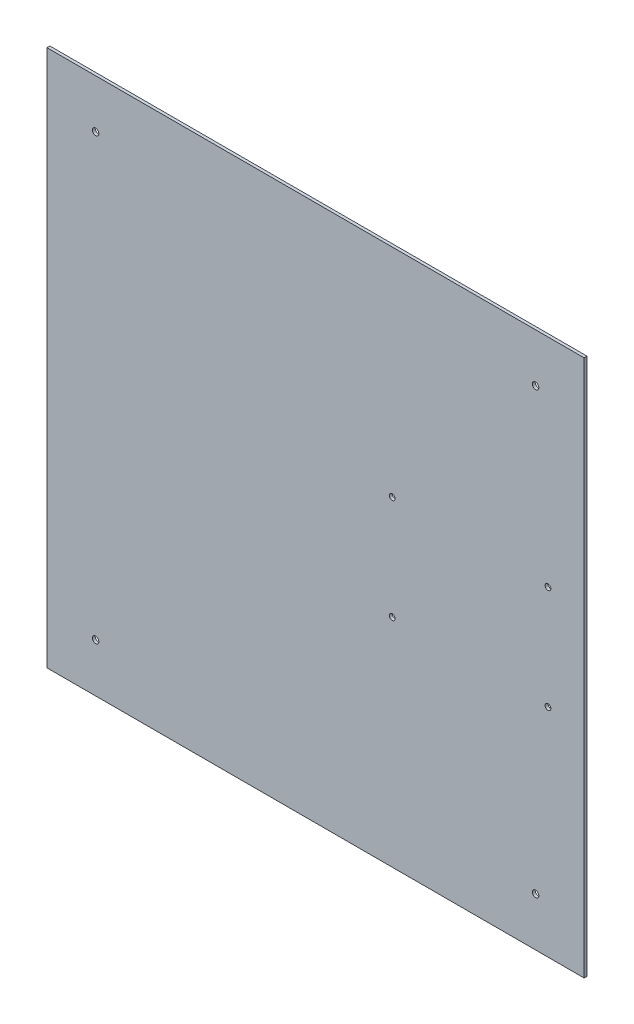
ISO-10303-21;
HEADER;
FILE_DESCRIPTION(('STEP AP214'),'2;1');
FILE_NAME('part.step','',(''),(''),'','','');
FILE_SCHEMA(('AUTOMOTIVE_DESIGN { 1 0 10303 214 1 1 1 1 }'));
ENDSEC;
DATA;
#1=APPLICATION_CONTEXT('core data for automotive mechanical design processes');
#2=APPLICATION_PROTOCOL_DEFINITION('international standard','automotive_design',2000,#1);
#3=PRODUCT_CONTEXT('',#1,'mechanical');
#4=PRODUCT('Part','Part','',(#3));
#5=PRODUCT_RELATED_PRODUCT_CATEGORY('part','',(#4));
#6=PRODUCT_DEFINITION_FORMATION('','',#4);
#7=PRODUCT_DEFINITION_CONTEXT('part definition',#1,'design');
#8=PRODUCT_DEFINITION('design','',#6,#7);
#9=PRODUCT_DEFINITION_SHAPE('','',#8);
#10=(LENGTH_UNIT() NAMED_UNIT(*) SI_UNIT(.MILLI.,.METRE.));
#11=(NAMED_UNIT(*) PLANE_ANGLE_UNIT() SI_UNIT($,.RADIAN.));
#12=(NAMED_UNIT(*) SI_UNIT($,.STERADIAN.) SOLID_ANGLE_UNIT());
#13=UNCERTAINTY_MEASURE_WITH_UNIT(LENGTH_MEASURE(1.E-05),#10,'distance_accuracy_value','');
#14=(GEOMETRIC_REPRESENTATION_CONTEXT(3) GLOBAL_UNCERTAINTY_ASSIGNED_CONTEXT((#13)) GLOBAL_UNIT_ASSIGNED_CONTEXT((#10,
#11,#12)) REPRESENTATION_CONTEXT('',''));
#15=CARTESIAN_POINT('',(0.,0.,0.));
#16=DIRECTION('',(0.,0.,1.));
#17=DIRECTION('',(1.,0.,0.));
#18=AXIS2_PLACEMENT_3D('',#15,#16,#17);
#19=CARTESIAN_POINT('',(185.,0.,2.));
#20=DIRECTION('',(1.,0.,0.));
#21=DIRECTION('',(0.,1.,0.));
#22=AXIS2_PLACEMENT_3D('',#19,#20,#21);
#23=PLANE('',#22);
#24=DIRECTION('',(0.,-1.,0.));
#25=VECTOR('',#24,1.);
#26=CARTESIAN_POINT('',(185.,0.,0.));
#27=LINE('',#26,#25);
#28=CARTESIAN_POINT('',(185.,185.,0.));
#29=VERTEX_POINT('',#28);
#30=CARTESIAN_POINT('',(185.,-185.,0.));
#31=VERTEX_POINT('',#30);
#32=EDGE_CURVE('E127',#29,#31,#27,.T.);
#33=ORIENTED_EDGE('',*,*,#32,.F.);
#34=DIRECTION('',(0.,0.,-1.));
#35=VECTOR('',#34,1.);
#36=CARTESIAN_POINT('',(185.,185.,2.));
#37=LINE('',#36,#35);
#38=CARTESIAN_POINT('',(185.,185.,2.));
#39=VERTEX_POINT('',#38);
#40=EDGE_CURVE('E11',#39,#29,#37,.T.);
#41=ORIENTED_EDGE('',*,*,#40,.F.);
#42=DIRECTION('',(0.,-1.,0.));
#43=VECTOR('',#42,1.);
#44=CARTESIAN_POINT('',(185.,0.,2.));
#45=LINE('',#44,#43);
#46=CARTESIAN_POINT('',(185.,-185.,2.));
#47=VERTEX_POINT('',#46);
#48=EDGE_CURVE('E96',#39,#47,#45,.T.);
#49=ORIENTED_EDGE('',*,*,#48,.T.);
#50=DIRECTION('',(0.,0.,-1.));
#51=VECTOR('',#50,1.);
#52=CARTESIAN_POINT('',(185.,-185.,2.));
#53=LINE('',#52,#51);
#54=EDGE_CURVE('E75',#47,#31,#53,.T.);
#55=ORIENTED_EDGE('',*,*,#54,.T.);
#56=EDGE_LOOP('',(#33,#41,#49,#55));
#57=FACE_BOUND('',#56,.T.);
#58=ADVANCED_FACE('F35',(#57),#23,.T.);
#59=CARTESIAN_POINT('',(0.,185.,2.));
#60=DIRECTION('',(0.,1.,0.));
#61=DIRECTION('',(0.,0.,1.));
#62=AXIS2_PLACEMENT_3D('',#59,#60,#61);
#63=PLANE('',#62);
#64=DIRECTION('',(1.,0.,0.));
#65=VECTOR('',#64,1.);
#66=CARTESIAN_POINT('',(0.,185.,0.));
#67=LINE('',#66,#65);
#68=CARTESIAN_POINT('',(-185.,185.,0.));
#69=VERTEX_POINT('',#68);
#70=EDGE_CURVE('E87',#69,#29,#67,.T.);
#71=ORIENTED_EDGE('',*,*,#70,.F.);
#72=DIRECTION('',(0.,0.,-1.));
#73=VECTOR('',#72,1.);
#74=CARTESIAN_POINT('',(-185.,185.,2.));
#75=LINE('',#74,#73);
#76=CARTESIAN_POINT('',(-185.,185.,2.));
#77=VERTEX_POINT('',#76);
#78=EDGE_CURVE('E44',#77,#69,#75,.T.);
#79=ORIENTED_EDGE('',*,*,#78,.F.);
#80=DIRECTION('',(1.,0.,0.));
#81=VECTOR('',#80,1.);
#82=CARTESIAN_POINT('',(0.,185.,2.));
#83=LINE('',#82,#81);
#84=EDGE_CURVE('E85',#77,#39,#83,.T.);
#85=ORIENTED_EDGE('',*,*,#84,.T.);
#86=ORIENTED_EDGE('',*,*,#40,.T.);
#87=EDGE_LOOP('',(#71,#79,#85,#86));
#88=FACE_BOUND('',#87,.T.);
#89=ADVANCED_FACE('F83',(#88),#63,.T.);
#90=CARTESIAN_POINT('',(-185.,0.,2.));
#91=DIRECTION('',(1.,0.,0.));
#92=DIRECTION('',(0.,1.,0.));
#93=AXIS2_PLACEMENT_3D('',#90,#91,#92);
#94=PLANE('',#93);
#95=DIRECTION('',(0.,-1.,0.));
#96=VECTOR('',#95,1.);
#97=CARTESIAN_POINT('',(-185.,0.,0.));
#98=LINE('',#97,#96);
#99=CARTESIAN_POINT('',(-185.,-185.,0.));
#100=VERTEX_POINT('',#99);
#101=EDGE_CURVE('E130',#69,#100,#98,.T.);
#102=ORIENTED_EDGE('',*,*,#101,.T.);
#103=DIRECTION('',(0.,0.,-1.));
#104=VECTOR('',#103,1.);
#105=CARTESIAN_POINT('',(-185.,-185.,2.));
#106=LINE('',#105,#104);
#107=CARTESIAN_POINT('',(-185.,-185.,2.));
#108=VERTEX_POINT('',#107);
#109=EDGE_CURVE('E90',#108,#100,#106,.T.);
#110=ORIENTED_EDGE('',*,*,#109,.F.);
#111=DIRECTION('',(0.,-1.,0.));
#112=VECTOR('',#111,1.);
#113=CARTESIAN_POINT('',(-185.,0.,2.));
#114=LINE('',#113,#112);
#115=EDGE_CURVE('E92',#77,#108,#114,.T.);
#116=ORIENTED_EDGE('',*,*,#115,.F.);
#117=ORIENTED_EDGE('',*,*,#78,.T.);
#118=EDGE_LOOP('',(#102,#110,#116,#117));
#119=FACE_BOUND('',#118,.T.);
#120=ADVANCED_FACE('F93',(#119),#94,.F.);
#121=CARTESIAN_POINT('',(-151.536171580347,151.536171580347,2.));
#122=DIRECTION('',(0.,0.,-1.));
#123=DIRECTION('',(-1.,0.,0.));
#124=AXIS2_PLACEMENT_3D('',#121,#122,#123);
#125=CYLINDRICAL_SURFACE('',#124,2.25000000000001);
#126=CARTESIAN_POINT('',(-151.536171580347,151.536171580347,2.));
#127=DIRECTION('',(0.,0.,1.));
#128=DIRECTION('',(1.,0.,0.));
#129=AXIS2_PLACEMENT_3D('',#126,#127,#128);
#130=CIRCLE('',#129,2.25000000000001);
#131=CARTESIAN_POINT('',(-149.286171580347,151.536171580347,2.));
#132=VERTEX_POINT('',#131);
#133=EDGE_CURVE('E98',#132,#132,#130,.T.);
#134=ORIENTED_EDGE('',*,*,#133,.T.);
#135=EDGE_LOOP('',(#134));
#136=FACE_BOUND('',#135,.T.);
#137=CARTESIAN_POINT('',(-151.536171580347,151.536171580347,0.));
#138=DIRECTION('',(0.,0.,1.));
#139=DIRECTION('',(1.,0.,0.));
#140=AXIS2_PLACEMENT_3D('',#137,#138,#139);
#141=CIRCLE('',#140,2.25000000000001);
#142=CARTESIAN_POINT('',(-149.286171580347,151.536171580347,0.));
#143=VERTEX_POINT('',#142);
#144=EDGE_CURVE('E124',#143,#143,#141,.T.);
#145=ORIENTED_EDGE('',*,*,#144,.F.);
#146=EDGE_LOOP('',(#145));
#147=FACE_BOUND('',#146,.T.);
#148=ADVANCED_FACE('F146',(#136,#147),#125,.F.);
#149=CARTESIAN_POINT('',(151.536171580346,151.536171580347,2.));
#150=DIRECTION('',(0.,0.,-1.));
#151=DIRECTION('',(-1.,0.,0.));
#152=AXIS2_PLACEMENT_3D('',#149,#150,#151);
#153=CYLINDRICAL_SURFACE('',#152,2.25000000000001);
#154=CARTESIAN_POINT('',(151.536171580346,151.536171580347,2.));
#155=DIRECTION('',(0.,0.,1.));
#156=DIRECTION('',(1.,0.,0.));
#157=AXIS2_PLACEMENT_3D('',#154,#155,#156);
#158=CIRCLE('',#157,2.25000000000001);
#159=CARTESIAN_POINT('',(153.786171580346,151.536171580347,2.));
#160=VERTEX_POINT('',#159);
#161=EDGE_CURVE('E320',#160,#160,#158,.T.);
#162=ORIENTED_EDGE('',*,*,#161,.T.);
#163=EDGE_LOOP('',(#162));
#164=FACE_BOUND('',#163,.T.);
#165=CARTESIAN_POINT('',(151.536171580346,151.536171580347,0.));
#166=DIRECTION('',(0.,0.,1.));
#167=DIRECTION('',(1.,0.,0.));
#168=AXIS2_PLACEMENT_3D('',#165,#166,#167);
#169=CIRCLE('',#168,2.25000000000001);
#170=CARTESIAN_POINT('',(153.786171580346,151.536171580347,0.));
#171=VERTEX_POINT('',#170);
#172=EDGE_CURVE('E121',#171,#171,#169,.T.);
#173=ORIENTED_EDGE('',*,*,#172,.F.);
#174=EDGE_LOOP('',(#173));
#175=FACE_BOUND('',#174,.T.);
#176=ADVANCED_FACE('F149',(#164,#175),#153,.F.);
#177=CARTESIAN_POINT('',(151.536171580347,-151.536171580347,2.));
#178=DIRECTION('',(0.,0.,-1.));
#179=DIRECTION('',(-1.,0.,0.));
#180=AXIS2_PLACEMENT_3D('',#177,#178,#179);
#181=CYLINDRICAL_SURFACE('',#180,2.25000000000001);
#182=CARTESIAN_POINT('',(151.536171580347,-151.536171580347,2.));
#183=DIRECTION('',(0.,0.,1.));
#184=DIRECTION('',(1.,0.,0.));
#185=AXIS2_PLACEMENT_3D('',#182,#183,#184);
#186=CIRCLE('',#185,2.25000000000001);
#187=CARTESIAN_POINT('',(153.786171580347,-151.536171580347,2.));
#188=VERTEX_POINT('',#187);
#189=EDGE_CURVE('E316',#188,#188,#186,.T.);
#190=ORIENTED_EDGE('',*,*,#189,.T.);
#191=EDGE_LOOP('',(#190));
#192=FACE_BOUND('',#191,.T.);
#193=CARTESIAN_POINT('',(151.536171580347,-151.536171580347,0.));
#194=DIRECTION('',(0.,0.,1.));
#195=DIRECTION('',(1.,0.,0.));
#196=AXIS2_PLACEMENT_3D('',#193,#194,#195);
#197=CIRCLE('',#196,2.25000000000001);
#198=CARTESIAN_POINT('',(153.786171580347,-151.536171580347,0.));
#199=VERTEX_POINT('',#198);
#200=EDGE_CURVE('E118',#199,#199,#197,.T.);
#201=ORIENTED_EDGE('',*,*,#200,.F.);
#202=EDGE_LOOP('',(#201));
#203=FACE_BOUND('',#202,.T.);
#204=ADVANCED_FACE('F153',(#192,#203),#181,.F.);
#205=CARTESIAN_POINT('',(-151.536171580347,-151.536171580347,2.));
#206=DIRECTION('',(0.,0.,-1.));
#207=DIRECTION('',(-1.,0.,0.));
#208=AXIS2_PLACEMENT_3D('',#205,#206,#207);
#209=CYLINDRICAL_SURFACE('',#208,2.25000000000001);
#210=CARTESIAN_POINT('',(-151.536171580347,-151.536171580347,2.));
#211=DIRECTION('',(0.,0.,1.));
#212=DIRECTION('',(1.,0.,0.));
#213=AXIS2_PLACEMENT_3D('',#210,#211,#212);
#214=CIRCLE('',#213,2.25000000000001);
#215=CARTESIAN_POINT('',(-149.286171580347,-151.536171580347,2.));
#216=VERTEX_POINT('',#215);
#217=EDGE_CURVE('E312',#216,#216,#214,.T.);
#218=ORIENTED_EDGE('',*,*,#217,.T.);
#219=EDGE_LOOP('',(#218));
#220=FACE_BOUND('',#219,.T.);
#221=CARTESIAN_POINT('',(-151.536171580347,-151.536171580347,0.));
#222=DIRECTION('',(0.,0.,1.));
#223=DIRECTION('',(1.,0.,0.));
#224=AXIS2_PLACEMENT_3D('',#221,#222,#223);
#225=CIRCLE('',#224,2.25000000000001);
#226=CARTESIAN_POINT('',(-149.286171580347,-151.536171580347,0.));
#227=VERTEX_POINT('',#226);
#228=EDGE_CURVE('E115',#227,#227,#225,.T.);
#229=ORIENTED_EDGE('',*,*,#228,.F.);
#230=EDGE_LOOP('',(#229));
#231=FACE_BOUND('',#230,.T.);
#232=ADVANCED_FACE('F157',(#220,#231),#209,.F.);
#233=CARTESIAN_POINT('',(52.7771094565122,35.7771019305349,2.));
#234=DIRECTION('',(0.,0.,-1.));
#235=DIRECTION('',(-1.,0.,0.));
#236=AXIS2_PLACEMENT_3D('',#233,#234,#235);
#237=CYLINDRICAL_SURFACE('',#236,2.);
#238=CARTESIAN_POINT('',(52.7771094565122,35.7771019305349,2.));
#239=DIRECTION('',(0.,0.,1.));
#240=DIRECTION('',(1.,0.,0.));
#241=AXIS2_PLACEMENT_3D('',#238,#239,#240);
#242=CIRCLE('',#241,2.);
#243=CARTESIAN_POINT('',(54.7771094565122,35.7771019305349,2.));
#244=VERTEX_POINT('',#243);
#245=EDGE_CURVE('E308',#244,#244,#242,.T.);
#246=ORIENTED_EDGE('',*,*,#245,.T.);
#247=EDGE_LOOP('',(#246));
#248=FACE_BOUND('',#247,.T.);
#249=CARTESIAN_POINT('',(52.7771094565122,35.7771019305349,0.));
#250=DIRECTION('',(0.,0.,1.));
#251=DIRECTION('',(1.,0.,0.));
#252=AXIS2_PLACEMENT_3D('',#249,#250,#251);
#253=CIRCLE('',#252,2.);
#254=CARTESIAN_POINT('',(54.7771094565122,35.7771019305349,0.));
#255=VERTEX_POINT('',#254);
#256=EDGE_CURVE('E112',#255,#255,#253,.T.);
#257=ORIENTED_EDGE('',*,*,#256,.F.);
#258=EDGE_LOOP('',(#257));
#259=FACE_BOUND('',#258,.T.);
#260=ADVANCED_FACE('F161',(#248,#259),#237,.F.);
#261=CARTESIAN_POINT('',(52.7802623523144,-35.775,2.));
#262=DIRECTION('',(0.,0.,-1.));
#263=DIRECTION('',(-1.,0.,0.));
#264=AXIS2_PLACEMENT_3D('',#261,#262,#263);
#265=CYLINDRICAL_SURFACE('',#264,2.);
#266=CARTESIAN_POINT('',(52.7802623523144,-35.775,2.));
#267=DIRECTION('',(0.,0.,1.));
#268=DIRECTION('',(1.,0.,0.));
#269=AXIS2_PLACEMENT_3D('',#266,#267,#268);
#270=CIRCLE('',#269,2.);
#271=CARTESIAN_POINT('',(54.7802623523144,-35.775,2.));
#272=VERTEX_POINT('',#271);
#273=EDGE_CURVE('E304',#272,#272,#270,.T.);
#274=ORIENTED_EDGE('',*,*,#273,.T.);
#275=EDGE_LOOP('',(#274));
#276=FACE_BOUND('',#275,.T.);
#277=CARTESIAN_POINT('',(52.7802623523144,-35.775,0.));
#278=DIRECTION('',(0.,0.,1.));
#279=DIRECTION('',(1.,0.,0.));
#280=AXIS2_PLACEMENT_3D('',#277,#278,#279);
#281=CIRCLE('',#280,2.);
#282=CARTESIAN_POINT('',(54.7802623523144,-35.775,0.));
#283=VERTEX_POINT('',#282);
#284=EDGE_CURVE('E109',#283,#283,#281,.T.);
#285=ORIENTED_EDGE('',*,*,#284,.F.);
#286=EDGE_LOOP('',(#285));
#287=FACE_BOUND('',#286,.T.);
#288=ADVANCED_FACE('F165',(#276,#287),#265,.F.);
#289=CARTESIAN_POINT('',(160.105262352314,35.7750000000001,2.));
#290=DIRECTION('',(0.,0.,-1.));
#291=DIRECTION('',(-1.,0.,0.));
#292=AXIS2_PLACEMENT_3D('',#289,#290,#291);
#293=CYLINDRICAL_SURFACE('',#292,2.);
#294=CARTESIAN_POINT('',(160.105262352314,35.7750000000001,2.));
#295=DIRECTION('',(0.,0.,1.));
#296=DIRECTION('',(1.,0.,0.));
#297=AXIS2_PLACEMENT_3D('',#294,#295,#296);
#298=CIRCLE('',#297,2.);
#299=CARTESIAN_POINT('',(162.105262352314,35.7750000000001,2.));
#300=VERTEX_POINT('',#299);
#301=EDGE_CURVE('E179',#300,#300,#298,.T.);
#302=ORIENTED_EDGE('',*,*,#301,.T.);
#303=EDGE_LOOP('',(#302));
#304=FACE_BOUND('',#303,.T.);
#305=CARTESIAN_POINT('',(160.105262352314,35.7750000000001,0.));
#306=DIRECTION('',(0.,0.,1.));
#307=DIRECTION('',(1.,0.,0.));
#308=AXIS2_PLACEMENT_3D('',#305,#306,#307);
#309=CIRCLE('',#308,2.);
#310=CARTESIAN_POINT('',(162.105262352314,35.7750000000001,0.));
#311=VERTEX_POINT('',#310);
#312=EDGE_CURVE('E106',#311,#311,#309,.T.);
#313=ORIENTED_EDGE('',*,*,#312,.F.);
#314=EDGE_LOOP('',(#313));
#315=FACE_BOUND('',#314,.T.);
#316=ADVANCED_FACE('F168',(#304,#315),#293,.F.);
#317=CARTESIAN_POINT('',(160.105262352314,-35.7749999999999,2.));
#318=DIRECTION('',(0.,0.,-1.));
#319=DIRECTION('',(-1.,0.,0.));
#320=AXIS2_PLACEMENT_3D('',#317,#318,#319);
#321=CYLINDRICAL_SURFACE('',#320,2.);
#322=CARTESIAN_POINT('',(160.105262352314,-35.7749999999999,2.));
#323=DIRECTION('',(0.,0.,1.));
#324=DIRECTION('',(1.,0.,0.));
#325=AXIS2_PLACEMENT_3D('',#322,#323,#324);
#326=CIRCLE('',#325,2.);
#327=CARTESIAN_POINT('',(162.105262352314,-35.7749999999999,2.));
#328=VERTEX_POINT('',#327);
#329=EDGE_CURVE('E133',#328,#328,#326,.T.);
#330=ORIENTED_EDGE('',*,*,#329,.T.);
#331=EDGE_LOOP('',(#330));
#332=FACE_BOUND('',#331,.T.);
#333=CARTESIAN_POINT('',(160.105262352314,-35.7749999999999,0.));
#334=DIRECTION('',(0.,0.,1.));
#335=DIRECTION('',(1.,0.,0.));
#336=AXIS2_PLACEMENT_3D('',#333,#334,#335);
#337=CIRCLE('',#336,2.);
#338=CARTESIAN_POINT('',(162.105262352314,-35.7749999999999,0.));
#339=VERTEX_POINT('',#338);
#340=EDGE_CURVE('E103',#339,#339,#337,.T.);
#341=ORIENTED_EDGE('',*,*,#340,.F.);
#342=EDGE_LOOP('',(#341));
#343=FACE_BOUND('',#342,.T.);
#344=ADVANCED_FACE('F37',(#332,#343),#321,.F.);
#345=CARTESIAN_POINT('',(0.,-185.,2.));
#346=DIRECTION('',(0.,1.,0.));
#347=DIRECTION('',(0.,0.,1.));
#348=AXIS2_PLACEMENT_3D('',#345,#346,#347);
#349=PLANE('',#348);
#350=DIRECTION('',(1.,0.,0.));
#351=VECTOR('',#350,1.);
#352=CARTESIAN_POINT('',(0.,-185.,0.));
#353=LINE('',#352,#351);
#354=EDGE_CURVE('E68',#100,#31,#353,.T.);
#355=ORIENTED_EDGE('',*,*,#354,.T.);
#356=ORIENTED_EDGE('',*,*,#54,.F.);
#357=DIRECTION('',(1.,0.,0.));
#358=VECTOR('',#357,1.);
#359=CARTESIAN_POINT('',(0.,-185.,2.));
#360=LINE('',#359,#358);
#361=EDGE_CURVE('E52',#108,#47,#360,.T.);
#362=ORIENTED_EDGE('',*,*,#361,.F.);
#363=ORIENTED_EDGE('',*,*,#109,.T.);
#364=EDGE_LOOP('',(#355,#356,#362,#363));
#365=FACE_BOUND('',#364,.T.);
#366=ADVANCED_FACE('F136',(#365),#349,.F.);
#367=CARTESIAN_POINT('',(0.,0.,2.));
#368=DIRECTION('',(0.,0.,1.));
#369=DIRECTION('',(1.,0.,0.));
#370=AXIS2_PLACEMENT_3D('',#367,#368,#369);
#371=PLANE('',#370);
#372=ORIENTED_EDGE('',*,*,#329,.F.);
#373=EDGE_LOOP('',(#372));
#374=FACE_BOUND('',#373,.T.);
#375=ORIENTED_EDGE('',*,*,#301,.F.);
#376=EDGE_LOOP('',(#375));
#377=FACE_BOUND('',#376,.T.);
#378=ORIENTED_EDGE('',*,*,#273,.F.);
#379=EDGE_LOOP('',(#378));
#380=FACE_BOUND('',#379,.T.);
#381=ORIENTED_EDGE('',*,*,#245,.F.);
#382=EDGE_LOOP('',(#381));
#383=FACE_BOUND('',#382,.T.);
#384=ORIENTED_EDGE('',*,*,#217,.F.);
#385=EDGE_LOOP('',(#384));
#386=FACE_BOUND('',#385,.T.);
#387=ORIENTED_EDGE('',*,*,#189,.F.);
#388=EDGE_LOOP('',(#387));
#389=FACE_BOUND('',#388,.T.);
#390=ORIENTED_EDGE('',*,*,#161,.F.);
#391=EDGE_LOOP('',(#390));
#392=FACE_BOUND('',#391,.T.);
#393=ORIENTED_EDGE('',*,*,#133,.F.);
#394=EDGE_LOOP('',(#393));
#395=FACE_BOUND('',#394,.T.);
#396=ORIENTED_EDGE('',*,*,#48,.F.);
#397=ORIENTED_EDGE('',*,*,#84,.F.);
#398=ORIENTED_EDGE('',*,*,#115,.T.);
#399=ORIENTED_EDGE('',*,*,#361,.T.);
#400=EDGE_LOOP('',(#396,#397,#398,#399));
#401=FACE_BOUND('',#400,.T.);
#402=ADVANCED_FACE('F95',(#374,#377,#380,#383,#386,#389,#392,#395,#401),#371,.T.);
#403=CARTESIAN_POINT('',(0.,0.,0.));
#404=DIRECTION('',(0.,0.,1.));
#405=DIRECTION('',(1.,0.,0.));
#406=AXIS2_PLACEMENT_3D('',#403,#404,#405);
#407=PLANE('',#406);
#408=ORIENTED_EDGE('',*,*,#340,.T.);
#409=EDGE_LOOP('',(#408));
#410=FACE_BOUND('',#409,.T.);
#411=ORIENTED_EDGE('',*,*,#312,.T.);
#412=EDGE_LOOP('',(#411));
#413=FACE_BOUND('',#412,.T.);
#414=ORIENTED_EDGE('',*,*,#284,.T.);
#415=EDGE_LOOP('',(#414));
#416=FACE_BOUND('',#415,.T.);
#417=ORIENTED_EDGE('',*,*,#256,.T.);
#418=EDGE_LOOP('',(#417));
#419=FACE_BOUND('',#418,.T.);
#420=ORIENTED_EDGE('',*,*,#228,.T.);
#421=EDGE_LOOP('',(#420));
#422=FACE_BOUND('',#421,.T.);
#423=ORIENTED_EDGE('',*,*,#200,.T.);
#424=EDGE_LOOP('',(#423));
#425=FACE_BOUND('',#424,.T.);
#426=ORIENTED_EDGE('',*,*,#172,.T.);
#427=EDGE_LOOP('',(#426));
#428=FACE_BOUND('',#427,.T.);
#429=ORIENTED_EDGE('',*,*,#144,.T.);
#430=EDGE_LOOP('',(#429));
#431=FACE_BOUND('',#430,.T.);
#432=ORIENTED_EDGE('',*,*,#32,.T.);
#433=ORIENTED_EDGE('',*,*,#354,.F.);
#434=ORIENTED_EDGE('',*,*,#101,.F.);
#435=ORIENTED_EDGE('',*,*,#70,.T.);
#436=EDGE_LOOP('',(#432,#433,#434,#435));
#437=FACE_BOUND('',#436,.T.);
#438=ADVANCED_FACE('F137',(#410,#413,#416,#419,#422,#425,#428,#431,#437),#407,.F.);
#439=CLOSED_SHELL('',(#58,#89,#120,#148,#176,#204,#232,#260,#288,#316,#344,#366,#402,#438));
#440=MANIFOLD_SOLID_BREP('B2',#439);
#441=ADVANCED_BREP_SHAPE_REPRESENTATION('',(#18,#440),#14);
#442=SHAPE_DEFINITION_REPRESENTATION(#9,#441);
ENDSEC;
END-ISO-10303-21;
